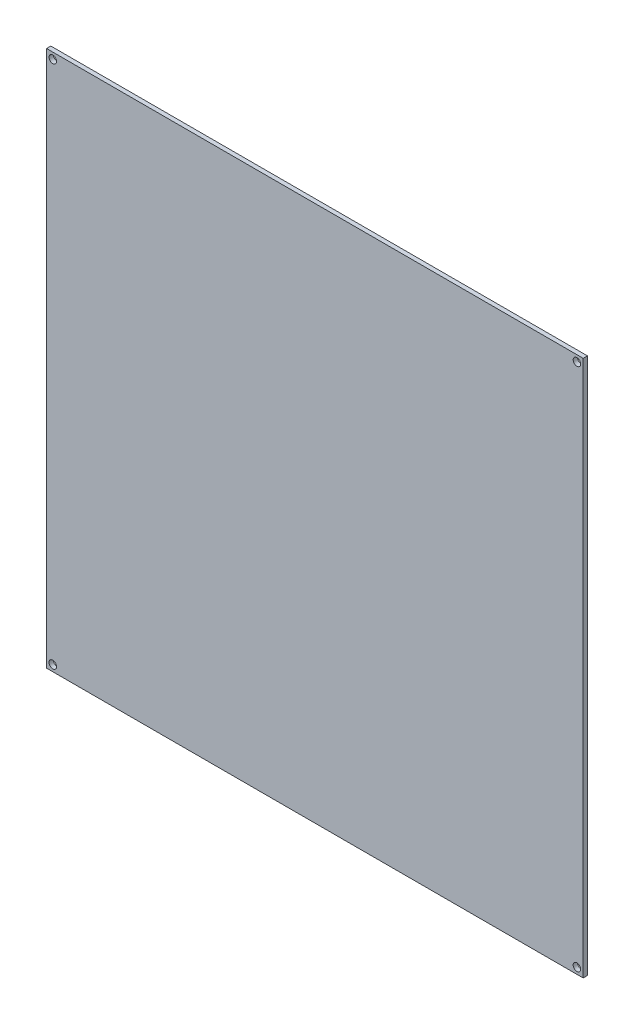
ISO-10303-21;
HEADER;
FILE_DESCRIPTION(('STEP AP214'),'2;1');
FILE_NAME('part.step','',(''),(''),'','','');
FILE_SCHEMA(('AUTOMOTIVE_DESIGN { 1 0 10303 214 1 1 1 1 }'));
ENDSEC;
DATA;
#1=APPLICATION_CONTEXT('core data for automotive mechanical design processes');
#2=APPLICATION_PROTOCOL_DEFINITION('international standard','automotive_design',2000,#1);
#3=PRODUCT_CONTEXT('',#1,'mechanical');
#4=PRODUCT('Part','Part','',(#3));
#5=PRODUCT_RELATED_PRODUCT_CATEGORY('part','',(#4));
#6=PRODUCT_DEFINITION_FORMATION('','',#4);
#7=PRODUCT_DEFINITION_CONTEXT('part definition',#1,'design');
#8=PRODUCT_DEFINITION('design','',#6,#7);
#9=PRODUCT_DEFINITION_SHAPE('','',#8);
#10=(LENGTH_UNIT() NAMED_UNIT(*) SI_UNIT(.MILLI.,.METRE.));
#11=(NAMED_UNIT(*) PLANE_ANGLE_UNIT() SI_UNIT($,.RADIAN.));
#12=(NAMED_UNIT(*) SI_UNIT($,.STERADIAN.) SOLID_ANGLE_UNIT());
#13=UNCERTAINTY_MEASURE_WITH_UNIT(LENGTH_MEASURE(1.E-05),#10,'distance_accuracy_value','');
#14=(GEOMETRIC_REPRESENTATION_CONTEXT(3) GLOBAL_UNCERTAINTY_ASSIGNED_CONTEXT((#13)) GLOBAL_UNIT_ASSIGNED_CONTEXT((#10,
#11,#12)) REPRESENTATION_CONTEXT('',''));
#15=CARTESIAN_POINT('',(0.,0.,0.));
#16=DIRECTION('',(0.,0.,1.));
#17=DIRECTION('',(1.,0.,0.));
#18=AXIS2_PLACEMENT_3D('',#15,#16,#17);
#19=CARTESIAN_POINT('',(0.,0.,-1.7));
#20=DIRECTION('',(-1.,0.,0.));
#21=DIRECTION('',(0.,0.,1.));
#22=AXIS2_PLACEMENT_3D('',#19,#20,#21);
#23=PLANE('',#22);
#24=DIRECTION('',(0.,-1.,0.));
#25=VECTOR('',#24,1.);
#26=CARTESIAN_POINT('',(0.,0.,0.));
#27=LINE('',#26,#25);
#28=CARTESIAN_POINT('',(0.,214.,0.));
#29=VERTEX_POINT('',#28);
#30=CARTESIAN_POINT('',(0.,0.,0.));
#31=VERTEX_POINT('',#30);
#32=EDGE_CURVE('E101',#29,#31,#27,.T.);
#33=ORIENTED_EDGE('',*,*,#32,.F.);
#34=DIRECTION('',(0.,0.,1.));
#35=VECTOR('',#34,1.);
#36=CARTESIAN_POINT('',(0.,214.,-1.7));
#37=LINE('',#36,#35);
#38=CARTESIAN_POINT('',(0.,214.,-1.7));
#39=VERTEX_POINT('',#38);
#40=EDGE_CURVE('E11',#39,#29,#37,.T.);
#41=ORIENTED_EDGE('',*,*,#40,.F.);
#42=DIRECTION('',(0.,-1.,0.));
#43=VECTOR('',#42,1.);
#44=CARTESIAN_POINT('',(0.,0.,-1.7));
#45=LINE('',#44,#43);
#46=CARTESIAN_POINT('',(0.,0.,-1.7));
#47=VERTEX_POINT('',#46);
#48=EDGE_CURVE('E94',#39,#47,#45,.T.);
#49=ORIENTED_EDGE('',*,*,#48,.T.);
#50=DIRECTION('',(0.,0.,1.));
#51=VECTOR('',#50,1.);
#52=CARTESIAN_POINT('',(0.,0.,-1.7));
#53=LINE('',#52,#51);
#54=EDGE_CURVE('E39',#47,#31,#53,.T.);
#55=ORIENTED_EDGE('',*,*,#54,.T.);
#56=EDGE_LOOP('',(#33,#41,#49,#55));
#57=FACE_BOUND('',#56,.T.);
#58=ADVANCED_FACE('F36',(#57),#23,.T.);
#59=CARTESIAN_POINT('',(0.,214.,-1.7));
#60=DIRECTION('',(0.,1.,0.));
#61=DIRECTION('',(0.,0.,1.));
#62=AXIS2_PLACEMENT_3D('',#59,#60,#61);
#63=PLANE('',#62);
#64=DIRECTION('',(-1.,0.,0.));
#65=VECTOR('',#64,1.);
#66=CARTESIAN_POINT('',(0.,214.,0.));
#67=LINE('',#66,#65);
#68=CARTESIAN_POINT('',(214.,214.,0.));
#69=VERTEX_POINT('',#68);
#70=EDGE_CURVE('E96',#69,#29,#67,.T.);
#71=ORIENTED_EDGE('',*,*,#70,.F.);
#72=DIRECTION('',(0.,0.,1.));
#73=VECTOR('',#72,1.);
#74=CARTESIAN_POINT('',(214.,214.,-1.7));
#75=LINE('',#74,#73);
#76=CARTESIAN_POINT('',(214.,214.,-1.7));
#77=VERTEX_POINT('',#76);
#78=EDGE_CURVE('E45',#77,#69,#75,.T.);
#79=ORIENTED_EDGE('',*,*,#78,.F.);
#80=DIRECTION('',(-1.,0.,0.));
#81=VECTOR('',#80,1.);
#82=CARTESIAN_POINT('',(0.,214.,-1.7));
#83=LINE('',#82,#81);
#84=EDGE_CURVE('E91',#77,#39,#83,.T.);
#85=ORIENTED_EDGE('',*,*,#84,.T.);
#86=ORIENTED_EDGE('',*,*,#40,.T.);
#87=EDGE_LOOP('',(#71,#79,#85,#86));
#88=FACE_BOUND('',#87,.T.);
#89=ADVANCED_FACE('F112',(#88),#63,.T.);
#90=CARTESIAN_POINT('',(214.,0.,-1.7));
#91=DIRECTION('',(1.,0.,0.));
#92=DIRECTION('',(0.,0.,-1.));
#93=AXIS2_PLACEMENT_3D('',#90,#91,#92);
#94=PLANE('',#93);
#95=DIRECTION('',(0.,1.,0.));
#96=VECTOR('',#95,1.);
#97=CARTESIAN_POINT('',(214.,0.,0.));
#98=LINE('',#97,#96);
#99=CARTESIAN_POINT('',(214.,0.,0.));
#100=VERTEX_POINT('',#99);
#101=EDGE_CURVE('E86',#100,#69,#98,.T.);
#102=ORIENTED_EDGE('',*,*,#101,.F.);
#103=DIRECTION('',(0.,0.,1.));
#104=VECTOR('',#103,1.);
#105=CARTESIAN_POINT('',(214.,0.,-1.7));
#106=LINE('',#105,#104);
#107=CARTESIAN_POINT('',(214.,0.,-1.7));
#108=VERTEX_POINT('',#107);
#109=EDGE_CURVE('E81',#108,#100,#106,.T.);
#110=ORIENTED_EDGE('',*,*,#109,.F.);
#111=DIRECTION('',(0.,1.,0.));
#112=VECTOR('',#111,1.);
#113=CARTESIAN_POINT('',(214.,0.,-1.7));
#114=LINE('',#113,#112);
#115=EDGE_CURVE('E84',#108,#77,#114,.T.);
#116=ORIENTED_EDGE('',*,*,#115,.T.);
#117=ORIENTED_EDGE('',*,*,#78,.T.);
#118=EDGE_LOOP('',(#102,#110,#116,#117));
#119=FACE_BOUND('',#118,.T.);
#120=ADVANCED_FACE('F83',(#119),#94,.T.);
#121=CARTESIAN_POINT('',(0.,0.,-1.7));
#122=DIRECTION('',(0.,-1.,0.));
#123=DIRECTION('',(0.,0.,-1.));
#124=AXIS2_PLACEMENT_3D('',#121,#122,#123);
#125=PLANE('',#124);
#126=DIRECTION('',(1.,0.,0.));
#127=VECTOR('',#126,1.);
#128=CARTESIAN_POINT('',(0.,0.,0.));
#129=LINE('',#128,#127);
#130=EDGE_CURVE('E104',#31,#100,#129,.T.);
#131=ORIENTED_EDGE('',*,*,#130,.F.);
#132=ORIENTED_EDGE('',*,*,#54,.F.);
#133=DIRECTION('',(1.,0.,0.));
#134=VECTOR('',#133,1.);
#135=CARTESIAN_POINT('',(0.,0.,-1.7));
#136=LINE('',#135,#134);
#137=EDGE_CURVE('E90',#47,#108,#136,.T.);
#138=ORIENTED_EDGE('',*,*,#137,.T.);
#139=ORIENTED_EDGE('',*,*,#109,.T.);
#140=EDGE_LOOP('',(#131,#132,#138,#139));
#141=FACE_BOUND('',#140,.T.);
#142=ADVANCED_FACE('F93',(#141),#125,.T.);
#143=CARTESIAN_POINT('',(0.,0.,-1.7));
#144=DIRECTION('',(0.,0.,-1.));
#145=DIRECTION('',(-1.,0.,0.));
#146=AXIS2_PLACEMENT_3D('',#143,#144,#145);
#147=PLANE('',#146);
#148=CARTESIAN_POINT('',(2.5,2.49999999999995,-1.7));
#149=DIRECTION('',(0.,0.,1.));
#150=DIRECTION('',(-1.,0.,0.));
#151=AXIS2_PLACEMENT_3D('',#148,#149,#150);
#152=CIRCLE('',#151,1.5);
#153=CARTESIAN_POINT('',(1.,2.49999999999995,-1.7));
#154=VERTEX_POINT('',#153);
#155=EDGE_CURVE('E153',#154,#154,#152,.T.);
#156=ORIENTED_EDGE('',*,*,#155,.T.);
#157=EDGE_LOOP('',(#156));
#158=FACE_BOUND('',#157,.T.);
#159=CARTESIAN_POINT('',(211.5,2.49999999999995,-1.7));
#160=DIRECTION('',(0.,0.,1.));
#161=DIRECTION('',(1.,0.,0.));
#162=AXIS2_PLACEMENT_3D('',#159,#160,#161);
#163=CIRCLE('',#162,1.5);
#164=CARTESIAN_POINT('',(213.,2.49999999999995,-1.7));
#165=VERTEX_POINT('',#164);
#166=EDGE_CURVE('E161',#165,#165,#163,.T.);
#167=ORIENTED_EDGE('',*,*,#166,.T.);
#168=EDGE_LOOP('',(#167));
#169=FACE_BOUND('',#168,.T.);
#170=CARTESIAN_POINT('',(211.5,211.5,-1.7));
#171=DIRECTION('',(0.,0.,1.));
#172=DIRECTION('',(-1.,0.,0.));
#173=AXIS2_PLACEMENT_3D('',#170,#171,#172);
#174=CIRCLE('',#173,1.5);
#175=CARTESIAN_POINT('',(210.,211.5,-1.7));
#176=VERTEX_POINT('',#175);
#177=EDGE_CURVE('E167',#176,#176,#174,.T.);
#178=ORIENTED_EDGE('',*,*,#177,.T.);
#179=EDGE_LOOP('',(#178));
#180=FACE_BOUND('',#179,.T.);
#181=CARTESIAN_POINT('',(2.5,211.5,-1.7));
#182=DIRECTION('',(0.,0.,1.));
#183=DIRECTION('',(1.,0.,0.));
#184=AXIS2_PLACEMENT_3D('',#181,#182,#183);
#185=CIRCLE('',#184,1.5);
#186=CARTESIAN_POINT('',(4.,211.5,-1.7));
#187=VERTEX_POINT('',#186);
#188=EDGE_CURVE('E105',#187,#187,#185,.T.);
#189=ORIENTED_EDGE('',*,*,#188,.T.);
#190=EDGE_LOOP('',(#189));
#191=FACE_BOUND('',#190,.T.);
#192=ORIENTED_EDGE('',*,*,#48,.F.);
#193=ORIENTED_EDGE('',*,*,#84,.F.);
#194=ORIENTED_EDGE('',*,*,#115,.F.);
#195=ORIENTED_EDGE('',*,*,#137,.F.);
#196=EDGE_LOOP('',(#192,#193,#194,#195));
#197=FACE_BOUND('',#196,.T.);
#198=ADVANCED_FACE('F89',(#158,#169,#180,#191,#197),#147,.T.);
#199=CARTESIAN_POINT('',(0.,0.,0.));
#200=DIRECTION('',(0.,0.,-1.));
#201=DIRECTION('',(-1.,0.,0.));
#202=AXIS2_PLACEMENT_3D('',#199,#200,#201);
#203=PLANE('',#202);
#204=CARTESIAN_POINT('',(2.5,2.49999999999995,0.));
#205=DIRECTION('',(0.,0.,1.));
#206=DIRECTION('',(-1.,0.,0.));
#207=AXIS2_PLACEMENT_3D('',#204,#205,#206);
#208=CIRCLE('',#207,1.5);
#209=CARTESIAN_POINT('',(1.,2.49999999999995,0.));
#210=VERTEX_POINT('',#209);
#211=EDGE_CURVE('E156',#210,#210,#208,.T.);
#212=ORIENTED_EDGE('',*,*,#211,.F.);
#213=EDGE_LOOP('',(#212));
#214=FACE_BOUND('',#213,.T.);
#215=CARTESIAN_POINT('',(211.5,2.49999999999995,0.));
#216=DIRECTION('',(0.,0.,1.));
#217=DIRECTION('',(1.,0.,0.));
#218=AXIS2_PLACEMENT_3D('',#215,#216,#217);
#219=CIRCLE('',#218,1.5);
#220=CARTESIAN_POINT('',(213.,2.49999999999995,0.));
#221=VERTEX_POINT('',#220);
#222=EDGE_CURVE('E158',#221,#221,#219,.T.);
#223=ORIENTED_EDGE('',*,*,#222,.F.);
#224=EDGE_LOOP('',(#223));
#225=FACE_BOUND('',#224,.T.);
#226=CARTESIAN_POINT('',(211.5,211.5,0.));
#227=DIRECTION('',(0.,0.,1.));
#228=DIRECTION('',(-1.,0.,0.));
#229=AXIS2_PLACEMENT_3D('',#226,#227,#228);
#230=CIRCLE('',#229,1.5);
#231=CARTESIAN_POINT('',(210.,211.5,0.));
#232=VERTEX_POINT('',#231);
#233=EDGE_CURVE('E164',#232,#232,#230,.T.);
#234=ORIENTED_EDGE('',*,*,#233,.F.);
#235=EDGE_LOOP('',(#234));
#236=FACE_BOUND('',#235,.T.);
#237=CARTESIAN_POINT('',(2.5,211.5,0.));
#238=DIRECTION('',(0.,0.,1.));
#239=DIRECTION('',(1.,0.,0.));
#240=AXIS2_PLACEMENT_3D('',#237,#238,#239);
#241=CIRCLE('',#240,1.5);
#242=CARTESIAN_POINT('',(4.,211.5,0.));
#243=VERTEX_POINT('',#242);
#244=EDGE_CURVE('E170',#243,#243,#241,.T.);
#245=ORIENTED_EDGE('',*,*,#244,.F.);
#246=EDGE_LOOP('',(#245));
#247=FACE_BOUND('',#246,.T.);
#248=ORIENTED_EDGE('',*,*,#32,.T.);
#249=ORIENTED_EDGE('',*,*,#130,.T.);
#250=ORIENTED_EDGE('',*,*,#101,.T.);
#251=ORIENTED_EDGE('',*,*,#70,.T.);
#252=EDGE_LOOP('',(#248,#249,#250,#251));
#253=FACE_BOUND('',#252,.T.);
#254=ADVANCED_FACE('F111',(#214,#225,#236,#247,#253),#203,.F.);
#255=CARTESIAN_POINT('',(2.5,211.5,-1.7));
#256=DIRECTION('',(0.,0.,1.));
#257=DIRECTION('',(1.,0.,0.));
#258=AXIS2_PLACEMENT_3D('',#255,#256,#257);
#259=CYLINDRICAL_SURFACE('',#258,1.5);
#260=ORIENTED_EDGE('',*,*,#188,.F.);
#261=EDGE_LOOP('',(#260));
#262=FACE_BOUND('',#261,.T.);
#263=ORIENTED_EDGE('',*,*,#244,.T.);
#264=EDGE_LOOP('',(#263));
#265=FACE_BOUND('',#264,.T.);
#266=ADVANCED_FACE('F130',(#262,#265),#259,.F.);
#267=CARTESIAN_POINT('',(211.5,211.5,-1.7));
#268=DIRECTION('',(0.,0.,1.));
#269=DIRECTION('',(1.,0.,0.));
#270=AXIS2_PLACEMENT_3D('',#267,#268,#269);
#271=CYLINDRICAL_SURFACE('',#270,1.5);
#272=ORIENTED_EDGE('',*,*,#177,.F.);
#273=EDGE_LOOP('',(#272));
#274=FACE_BOUND('',#273,.T.);
#275=ORIENTED_EDGE('',*,*,#233,.T.);
#276=EDGE_LOOP('',(#275));
#277=FACE_BOUND('',#276,.T.);
#278=ADVANCED_FACE('F137',(#274,#277),#271,.F.);
#279=CARTESIAN_POINT('',(211.5,2.49999999999995,-1.7));
#280=DIRECTION('',(0.,0.,1.));
#281=DIRECTION('',(1.,0.,0.));
#282=AXIS2_PLACEMENT_3D('',#279,#280,#281);
#283=CYLINDRICAL_SURFACE('',#282,1.5);
#284=ORIENTED_EDGE('',*,*,#166,.F.);
#285=EDGE_LOOP('',(#284));
#286=FACE_BOUND('',#285,.T.);
#287=ORIENTED_EDGE('',*,*,#222,.T.);
#288=EDGE_LOOP('',(#287));
#289=FACE_BOUND('',#288,.T.);
#290=ADVANCED_FACE('F141',(#286,#289),#283,.F.);
#291=CARTESIAN_POINT('',(2.5,2.49999999999995,-1.7));
#292=DIRECTION('',(0.,0.,1.));
#293=DIRECTION('',(1.,0.,0.));
#294=AXIS2_PLACEMENT_3D('',#291,#292,#293);
#295=CYLINDRICAL_SURFACE('',#294,1.5);
#296=ORIENTED_EDGE('',*,*,#155,.F.);
#297=EDGE_LOOP('',(#296));
#298=FACE_BOUND('',#297,.T.);
#299=ORIENTED_EDGE('',*,*,#211,.T.);
#300=EDGE_LOOP('',(#299));
#301=FACE_BOUND('',#300,.T.);
#302=ADVANCED_FACE('F145',(#298,#301),#295,.F.);
#303=CLOSED_SHELL('',(#58,#89,#120,#142,#198,#254,#266,#278,#290,#302));
#304=MANIFOLD_SOLID_BREP('B2',#303);
#305=ADVANCED_BREP_SHAPE_REPRESENTATION('',(#18,#304),#14);
#306=SHAPE_DEFINITION_REPRESENTATION(#9,#305);
ENDSEC;
END-ISO-10303-21;
